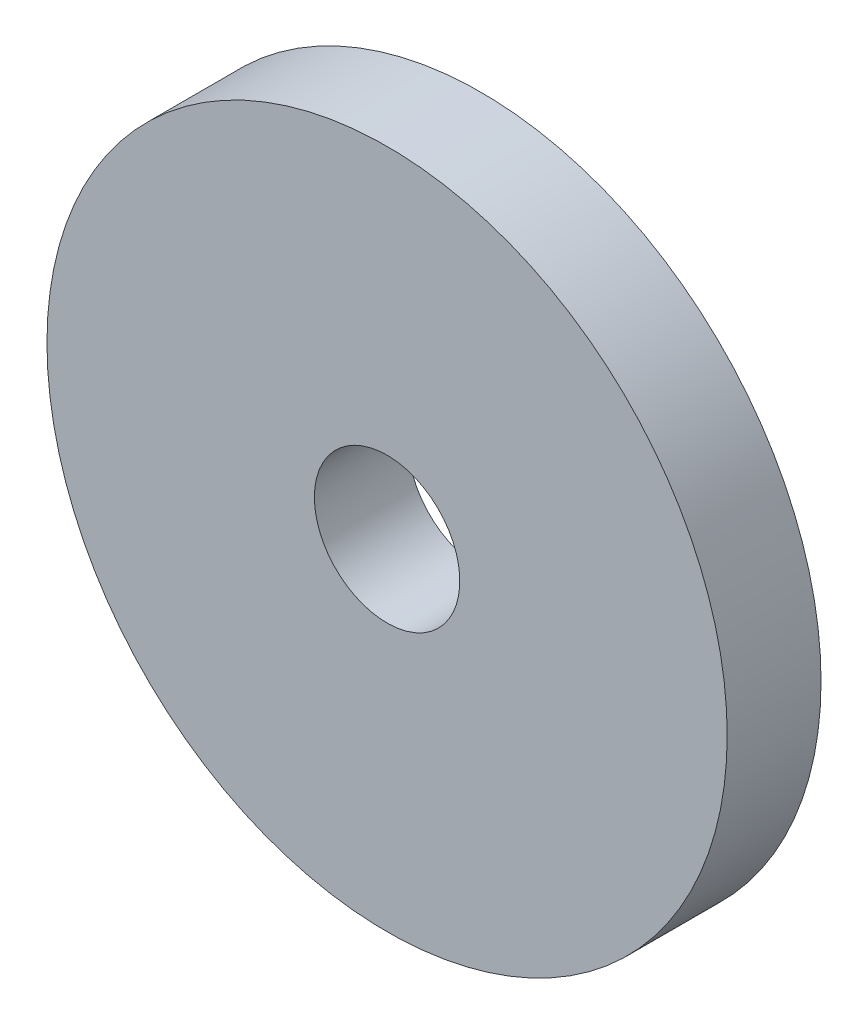
ISO-10303-21;
HEADER;
FILE_DESCRIPTION(('STEP AP214'),'2;1');
FILE_NAME('part.step','',(''),(''),'','','');
FILE_SCHEMA(('AUTOMOTIVE_DESIGN { 1 0 10303 214 1 1 1 1 }'));
ENDSEC;
DATA;
#1=APPLICATION_CONTEXT('core data for automotive mechanical design processes');
#2=APPLICATION_PROTOCOL_DEFINITION('international standard','automotive_design',2000,#1);
#3=PRODUCT_CONTEXT('',#1,'mechanical');
#4=PRODUCT('Part','Part','',(#3));
#5=PRODUCT_RELATED_PRODUCT_CATEGORY('part','',(#4));
#6=PRODUCT_DEFINITION_FORMATION('','',#4);
#7=PRODUCT_DEFINITION_CONTEXT('part definition',#1,'design');
#8=PRODUCT_DEFINITION('design','',#6,#7);
#9=PRODUCT_DEFINITION_SHAPE('','',#8);
#10=(LENGTH_UNIT() NAMED_UNIT(*) SI_UNIT(.MILLI.,.METRE.));
#11=(NAMED_UNIT(*) PLANE_ANGLE_UNIT() SI_UNIT($,.RADIAN.));
#12=(NAMED_UNIT(*) SI_UNIT($,.STERADIAN.) SOLID_ANGLE_UNIT());
#13=UNCERTAINTY_MEASURE_WITH_UNIT(LENGTH_MEASURE(1.E-05),#10,'distance_accuracy_value','');
#14=(GEOMETRIC_REPRESENTATION_CONTEXT(3) GLOBAL_UNCERTAINTY_ASSIGNED_CONTEXT((#13)) GLOBAL_UNIT_ASSIGNED_CONTEXT((#10,
#11,#12)) REPRESENTATION_CONTEXT('',''));
#15=CARTESIAN_POINT('',(0.,0.,0.));
#16=DIRECTION('',(0.,0.,1.));
#17=DIRECTION('',(1.,0.,0.));
#18=AXIS2_PLACEMENT_3D('',#15,#16,#17);
#19=CARTESIAN_POINT('',(0.,0.,2.));
#20=DIRECTION('',(0.,0.,-1.));
#21=DIRECTION('',(-1.,0.,0.));
#22=AXIS2_PLACEMENT_3D('',#19,#20,#21);
#23=CYLINDRICAL_SURFACE('',#22,7.25);
#24=CARTESIAN_POINT('',(0.,0.,2.));
#25=DIRECTION('',(0.,0.,1.));
#26=DIRECTION('',(1.,0.,0.));
#27=AXIS2_PLACEMENT_3D('',#24,#25,#26);
#28=CIRCLE('',#27,7.25);
#29=CARTESIAN_POINT('',(7.25,0.,2.));
#30=VERTEX_POINT('',#29);
#31=EDGE_CURVE('E10',#30,#30,#28,.T.);
#32=ORIENTED_EDGE('',*,*,#31,.F.);
#33=EDGE_LOOP('',(#32));
#34=FACE_BOUND('',#33,.T.);
#35=CARTESIAN_POINT('',(0.,0.,0.));
#36=DIRECTION('',(0.,0.,1.));
#37=DIRECTION('',(1.,0.,0.));
#38=AXIS2_PLACEMENT_3D('',#35,#36,#37);
#39=CIRCLE('',#38,7.25);
#40=CARTESIAN_POINT('',(7.25,0.,0.));
#41=VERTEX_POINT('',#40);
#42=EDGE_CURVE('E40',#41,#41,#39,.T.);
#43=ORIENTED_EDGE('',*,*,#42,.T.);
#44=EDGE_LOOP('',(#43));
#45=FACE_BOUND('',#44,.T.);
#46=ADVANCED_FACE('F37',(#34,#45),#23,.T.);
#47=CARTESIAN_POINT('',(0.,0.,2.));
#48=DIRECTION('',(0.,0.,1.));
#49=DIRECTION('',(1.,0.,0.));
#50=AXIS2_PLACEMENT_3D('',#47,#48,#49);
#51=PLANE('',#50);
#52=CARTESIAN_POINT('',(0.,0.,2.));
#53=DIRECTION('',(0.,0.,-1.));
#54=DIRECTION('',(-1.,0.,0.));
#55=AXIS2_PLACEMENT_3D('',#52,#53,#54);
#56=CIRCLE('',#55,1.55);
#57=CARTESIAN_POINT('',(-1.55,0.,2.));
#58=VERTEX_POINT('',#57);
#59=EDGE_CURVE('E47',#58,#58,#56,.T.);
#60=ORIENTED_EDGE('',*,*,#59,.T.);
#61=EDGE_LOOP('',(#60));
#62=FACE_BOUND('',#61,.T.);
#63=ORIENTED_EDGE('',*,*,#31,.T.);
#64=EDGE_LOOP('',(#63));
#65=FACE_BOUND('',#64,.T.);
#66=ADVANCED_FACE('F55',(#62,#65),#51,.T.);
#67=CARTESIAN_POINT('',(0.,0.,0.));
#68=DIRECTION('',(0.,0.,1.));
#69=DIRECTION('',(1.,0.,0.));
#70=AXIS2_PLACEMENT_3D('',#67,#68,#69);
#71=PLANE('',#70);
#72=CARTESIAN_POINT('',(0.,0.,0.));
#73=DIRECTION('',(0.,0.,-1.));
#74=DIRECTION('',(-1.,0.,0.));
#75=AXIS2_PLACEMENT_3D('',#72,#73,#74);
#76=CIRCLE('',#75,1.55);
#77=CARTESIAN_POINT('',(-1.55,0.,0.));
#78=VERTEX_POINT('',#77);
#79=EDGE_CURVE('E49',#78,#78,#76,.T.);
#80=ORIENTED_EDGE('',*,*,#79,.F.);
#81=EDGE_LOOP('',(#80));
#82=FACE_BOUND('',#81,.T.);
#83=ORIENTED_EDGE('',*,*,#42,.F.);
#84=EDGE_LOOP('',(#83));
#85=FACE_BOUND('',#84,.T.);
#86=ADVANCED_FACE('F60',(#82,#85),#71,.F.);
#87=CARTESIAN_POINT('',(0.,0.,2.));
#88=DIRECTION('',(0.,0.,-1.));
#89=DIRECTION('',(-1.,0.,0.));
#90=AXIS2_PLACEMENT_3D('',#87,#88,#89);
#91=CYLINDRICAL_SURFACE('',#90,1.55);
#92=ORIENTED_EDGE('',*,*,#59,.F.);
#93=EDGE_LOOP('',(#92));
#94=FACE_BOUND('',#93,.T.);
#95=ORIENTED_EDGE('',*,*,#79,.T.);
#96=EDGE_LOOP('',(#95));
#97=FACE_BOUND('',#96,.T.);
#98=ADVANCED_FACE('F57',(#94,#97),#91,.F.);
#99=CLOSED_SHELL('',(#46,#66,#86,#98));
#100=MANIFOLD_SOLID_BREP('B2',#99);
#101=ADVANCED_BREP_SHAPE_REPRESENTATION('',(#18,#100),#14);
#102=SHAPE_DEFINITION_REPRESENTATION(#9,#101);
ENDSEC;
END-ISO-10303-21;
